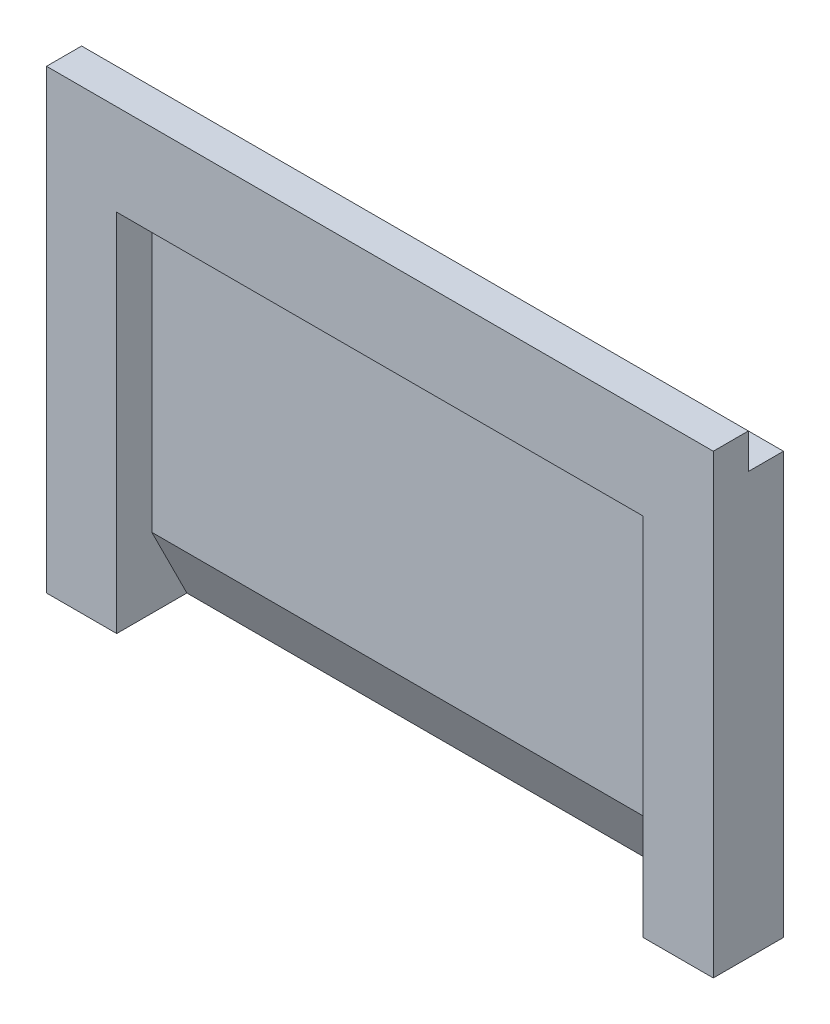
ISO-10303-21;
HEADER;
FILE_DESCRIPTION(('STEP AP214'),'2;1');
FILE_NAME('part.step','',(''),(''),'','','');
FILE_SCHEMA(('AUTOMOTIVE_DESIGN { 1 0 10303 214 1 1 1 1 }'));
ENDSEC;
DATA;
#1=APPLICATION_CONTEXT('core data for automotive mechanical design processes');
#2=APPLICATION_PROTOCOL_DEFINITION('international standard','automotive_design',2000,#1);
#3=PRODUCT_CONTEXT('',#1,'mechanical');
#4=PRODUCT('Part','Part','',(#3));
#5=PRODUCT_RELATED_PRODUCT_CATEGORY('part','',(#4));
#6=PRODUCT_DEFINITION_FORMATION('','',#4);
#7=PRODUCT_DEFINITION_CONTEXT('part definition',#1,'design');
#8=PRODUCT_DEFINITION('design','',#6,#7);
#9=PRODUCT_DEFINITION_SHAPE('','',#8);
#10=(LENGTH_UNIT() NAMED_UNIT(*) SI_UNIT(.MILLI.,.METRE.));
#11=(NAMED_UNIT(*) PLANE_ANGLE_UNIT() SI_UNIT($,.RADIAN.));
#12=(NAMED_UNIT(*) SI_UNIT($,.STERADIAN.) SOLID_ANGLE_UNIT());
#13=UNCERTAINTY_MEASURE_WITH_UNIT(LENGTH_MEASURE(1.E-05),#10,'distance_accuracy_value','');
#14=(GEOMETRIC_REPRESENTATION_CONTEXT(3) GLOBAL_UNCERTAINTY_ASSIGNED_CONTEXT((#13)) GLOBAL_UNIT_ASSIGNED_CONTEXT((#10,
#11,#12)) REPRESENTATION_CONTEXT('',''));
#15=CARTESIAN_POINT('',(0.,0.,0.));
#16=DIRECTION('',(0.,0.,1.));
#17=DIRECTION('',(1.,0.,0.));
#18=AXIS2_PLACEMENT_3D('',#15,#16,#17);
#19=CARTESIAN_POINT('',(0.,60.,10.));
#20=DIRECTION('',(0.,-1.,0.));
#21=DIRECTION('',(0.,0.,-1.));
#22=AXIS2_PLACEMENT_3D('',#19,#20,#21);
#23=PLANE('',#22);
#24=DIRECTION('',(-1.,0.,0.));
#25=VECTOR('',#24,1.);
#26=CARTESIAN_POINT('',(0.,60.,5.));
#27=LINE('',#26,#25);
#28=CARTESIAN_POINT('',(95.,60.,5.));
#29=VERTEX_POINT('',#28);
#30=CARTESIAN_POINT('',(0.,60.,5.));
#31=VERTEX_POINT('',#30);
#32=EDGE_CURVE('E50',#29,#31,#27,.T.);
#33=ORIENTED_EDGE('',*,*,#32,.F.);
#34=DIRECTION('',(0.,0.,-1.));
#35=VECTOR('',#34,1.);
#36=CARTESIAN_POINT('',(95.,60.,10.));
#37=LINE('',#36,#35);
#38=CARTESIAN_POINT('',(95.,60.,0.));
#39=VERTEX_POINT('',#38);
#40=EDGE_CURVE('E205',#29,#39,#37,.T.);
#41=ORIENTED_EDGE('',*,*,#40,.T.);
#42=DIRECTION('',(-1.,0.,0.));
#43=VECTOR('',#42,1.);
#44=CARTESIAN_POINT('',(0.,60.,0.));
#45=LINE('',#44,#43);
#46=CARTESIAN_POINT('',(0.,60.,0.));
#47=VERTEX_POINT('',#46);
#48=EDGE_CURVE('E129',#39,#47,#45,.T.);
#49=ORIENTED_EDGE('',*,*,#48,.T.);
#50=DIRECTION('',(0.,0.,-1.));
#51=VECTOR('',#50,1.);
#52=CARTESIAN_POINT('',(0.,60.,10.));
#53=LINE('',#52,#51);
#54=EDGE_CURVE('E193',#31,#47,#53,.T.);
#55=ORIENTED_EDGE('',*,*,#54,.F.);
#56=EDGE_LOOP('',(#33,#41,#49,#55));
#57=FACE_BOUND('',#56,.T.);
#58=ADVANCED_FACE('F35',(#57),#23,.F.);
#59=CARTESIAN_POINT('',(0.,0.,10.));
#60=DIRECTION('',(0.,1.,0.));
#61=DIRECTION('',(0.,0.,1.));
#62=AXIS2_PLACEMENT_3D('',#59,#60,#61);
#63=PLANE('',#62);
#64=DIRECTION('',(1.,0.,0.));
#65=VECTOR('',#64,1.);
#66=CARTESIAN_POINT('',(0.,0.,0.));
#67=LINE('',#66,#65);
#68=CARTESIAN_POINT('',(0.,0.,0.));
#69=VERTEX_POINT('',#68);
#70=CARTESIAN_POINT('',(10.,0.,0.));
#71=VERTEX_POINT('',#70);
#72=EDGE_CURVE('E196',#69,#71,#67,.T.);
#73=ORIENTED_EDGE('',*,*,#72,.T.);
#74=DIRECTION('',(0.,0.,-1.));
#75=VECTOR('',#74,1.);
#76=CARTESIAN_POINT('',(10.,0.,10.));
#77=LINE('',#76,#75);
#78=CARTESIAN_POINT('',(10.,0.,10.));
#79=VERTEX_POINT('',#78);
#80=EDGE_CURVE('E154',#79,#71,#77,.T.);
#81=ORIENTED_EDGE('',*,*,#80,.F.);
#82=DIRECTION('',(1.,0.,0.));
#83=VECTOR('',#82,1.);
#84=CARTESIAN_POINT('',(0.,0.,10.));
#85=LINE('',#84,#83);
#86=CARTESIAN_POINT('',(0.,0.,10.));
#87=VERTEX_POINT('',#86);
#88=EDGE_CURVE('E190',#87,#79,#85,.T.);
#89=ORIENTED_EDGE('',*,*,#88,.F.);
#90=DIRECTION('',(0.,0.,-1.));
#91=VECTOR('',#90,1.);
#92=CARTESIAN_POINT('',(0.,0.,10.));
#93=LINE('',#92,#91);
#94=EDGE_CURVE('E11',#87,#69,#93,.T.);
#95=ORIENTED_EDGE('',*,*,#94,.T.);
#96=EDGE_LOOP('',(#73,#81,#89,#95));
#97=FACE_BOUND('',#96,.T.);
#98=ADVANCED_FACE('F233',(#97),#63,.F.);
#99=CARTESIAN_POINT('',(0.,0.,10.));
#100=DIRECTION('',(0.,0.,-1.));
#101=DIRECTION('',(-1.,0.,0.));
#102=AXIS2_PLACEMENT_3D('',#99,#100,#101);
#103=PLANE('',#102);
#104=ORIENTED_EDGE('',*,*,#88,.T.);
#105=DIRECTION('',(0.,-1.,0.));
#106=VECTOR('',#105,1.);
#107=CARTESIAN_POINT('',(10.,50.,10.));
#108=LINE('',#107,#106);
#109=CARTESIAN_POINT('',(10.,52.,10.));
#110=VERTEX_POINT('',#109);
#111=EDGE_CURVE('E172',#110,#79,#108,.T.);
#112=ORIENTED_EDGE('',*,*,#111,.F.);
#113=DIRECTION('',(1.,0.,0.));
#114=VECTOR('',#113,1.);
#115=CARTESIAN_POINT('',(10.,52.,10.));
#116=LINE('',#115,#114);
#117=CARTESIAN_POINT('',(85.,52.,10.));
#118=VERTEX_POINT('',#117);
#119=EDGE_CURVE('E164',#110,#118,#116,.T.);
#120=ORIENTED_EDGE('',*,*,#119,.T.);
#121=DIRECTION('',(0.,1.,0.));
#122=VECTOR('',#121,1.);
#123=CARTESIAN_POINT('',(85.,10.,10.));
#124=LINE('',#123,#122);
#125=CARTESIAN_POINT('',(85.,0.,10.));
#126=VERTEX_POINT('',#125);
#127=EDGE_CURVE('E183',#126,#118,#124,.T.);
#128=ORIENTED_EDGE('',*,*,#127,.F.);
#129=CARTESIAN_POINT('',(95.,0.,10.));
#130=VERTEX_POINT('',#129);
#131=EDGE_CURVE('E128',#126,#130,#85,.T.);
#132=ORIENTED_EDGE('',*,*,#131,.T.);
#133=DIRECTION('',(0.,1.,0.));
#134=VECTOR('',#133,1.);
#135=CARTESIAN_POINT('',(95.,0.,10.));
#136=LINE('',#135,#134);
#137=CARTESIAN_POINT('',(95.,65.,10.));
#138=VERTEX_POINT('',#137);
#139=EDGE_CURVE('E135',#130,#138,#136,.T.);
#140=ORIENTED_EDGE('',*,*,#139,.T.);
#141=DIRECTION('',(1.,0.,0.));
#142=VECTOR('',#141,1.);
#143=CARTESIAN_POINT('',(0.,65.,10.));
#144=LINE('',#143,#142);
#145=CARTESIAN_POINT('',(0.,65.,10.));
#146=VERTEX_POINT('',#145);
#147=EDGE_CURVE('E132',#146,#138,#144,.T.);
#148=ORIENTED_EDGE('',*,*,#147,.F.);
#149=DIRECTION('',(0.,-1.,0.));
#150=VECTOR('',#149,1.);
#151=CARTESIAN_POINT('',(0.,0.,10.));
#152=LINE('',#151,#150);
#153=EDGE_CURVE('E120',#146,#87,#152,.T.);
#154=ORIENTED_EDGE('',*,*,#153,.T.);
#155=EDGE_LOOP('',(#104,#112,#120,#128,#132,#140,#148,#154));
#156=FACE_BOUND('',#155,.T.);
#157=ADVANCED_FACE('F133',(#156),#103,.F.);
#158=CARTESIAN_POINT('',(0.,0.,10.));
#159=DIRECTION('',(1.,0.,0.));
#160=DIRECTION('',(0.,0.,-1.));
#161=AXIS2_PLACEMENT_3D('',#158,#159,#160);
#162=PLANE('',#161);
#163=DIRECTION('',(0.,-1.,0.));
#164=VECTOR('',#163,1.);
#165=CARTESIAN_POINT('',(0.,0.,0.));
#166=LINE('',#165,#164);
#167=EDGE_CURVE('E188',#47,#69,#166,.T.);
#168=ORIENTED_EDGE('',*,*,#167,.T.);
#169=ORIENTED_EDGE('',*,*,#94,.F.);
#170=ORIENTED_EDGE('',*,*,#153,.F.);
#171=DIRECTION('',(0.,0.,1.));
#172=VECTOR('',#171,1.);
#173=CARTESIAN_POINT('',(0.,65.,10.));
#174=LINE('',#173,#172);
#175=CARTESIAN_POINT('',(0.,65.,5.));
#176=VERTEX_POINT('',#175);
#177=EDGE_CURVE('E125',#176,#146,#174,.T.);
#178=ORIENTED_EDGE('',*,*,#177,.F.);
#179=DIRECTION('',(0.,-1.,0.));
#180=VECTOR('',#179,1.);
#181=CARTESIAN_POINT('',(0.,65.,5.));
#182=LINE('',#181,#180);
#183=EDGE_CURVE('E148',#176,#31,#182,.T.);
#184=ORIENTED_EDGE('',*,*,#183,.T.);
#185=ORIENTED_EDGE('',*,*,#54,.T.);
#186=EDGE_LOOP('',(#168,#169,#170,#178,#184,#185));
#187=FACE_BOUND('',#186,.T.);
#188=ADVANCED_FACE('F37',(#187),#162,.F.);
#189=ORIENTED_EDGE('',*,*,#131,.F.);
#190=DIRECTION('',(0.,0.,-1.));
#191=VECTOR('',#190,1.);
#192=CARTESIAN_POINT('',(85.,0.,10.));
#193=LINE('',#192,#191);
#194=CARTESIAN_POINT('',(85.,0.,0.));
#195=VERTEX_POINT('',#194);
#196=EDGE_CURVE('E158',#126,#195,#193,.T.);
#197=ORIENTED_EDGE('',*,*,#196,.T.);
#198=CARTESIAN_POINT('',(95.,0.,0.));
#199=VERTEX_POINT('',#198);
#200=EDGE_CURVE('E195',#195,#199,#67,.T.);
#201=ORIENTED_EDGE('',*,*,#200,.T.);
#202=DIRECTION('',(0.,0.,-1.));
#203=VECTOR('',#202,1.);
#204=CARTESIAN_POINT('',(95.,0.,10.));
#205=LINE('',#204,#203);
#206=EDGE_CURVE('E43',#130,#199,#205,.T.);
#207=ORIENTED_EDGE('',*,*,#206,.F.);
#208=EDGE_LOOP('',(#189,#197,#201,#207));
#209=FACE_BOUND('',#208,.T.);
#210=ADVANCED_FACE('F239',(#209),#63,.F.);
#211=CARTESIAN_POINT('',(95.,0.,10.));
#212=DIRECTION('',(-1.,0.,0.));
#213=DIRECTION('',(0.,0.,1.));
#214=AXIS2_PLACEMENT_3D('',#211,#212,#213);
#215=PLANE('',#214);
#216=DIRECTION('',(0.,1.,0.));
#217=VECTOR('',#216,1.);
#218=CARTESIAN_POINT('',(95.,0.,0.));
#219=LINE('',#218,#217);
#220=EDGE_CURVE('E199',#199,#39,#219,.T.);
#221=ORIENTED_EDGE('',*,*,#220,.T.);
#222=ORIENTED_EDGE('',*,*,#40,.F.);
#223=DIRECTION('',(0.,-1.,0.));
#224=VECTOR('',#223,1.);
#225=CARTESIAN_POINT('',(95.,65.,5.));
#226=LINE('',#225,#224);
#227=CARTESIAN_POINT('',(95.,65.,5.));
#228=VERTEX_POINT('',#227);
#229=EDGE_CURVE('E151',#228,#29,#226,.T.);
#230=ORIENTED_EDGE('',*,*,#229,.F.);
#231=DIRECTION('',(0.,0.,-1.));
#232=VECTOR('',#231,1.);
#233=CARTESIAN_POINT('',(95.,65.,10.));
#234=LINE('',#233,#232);
#235=EDGE_CURVE('E138',#138,#228,#234,.T.);
#236=ORIENTED_EDGE('',*,*,#235,.F.);
#237=ORIENTED_EDGE('',*,*,#139,.F.);
#238=ORIENTED_EDGE('',*,*,#206,.T.);
#239=EDGE_LOOP('',(#221,#222,#230,#236,#237,#238));
#240=FACE_BOUND('',#239,.T.);
#241=ADVANCED_FACE('F210',(#240),#215,.F.);
#242=CARTESIAN_POINT('',(0.,0.,0.));
#243=DIRECTION('',(0.,0.,-1.));
#244=DIRECTION('',(-1.,0.,0.));
#245=AXIS2_PLACEMENT_3D('',#242,#243,#244);
#246=PLANE('',#245);
#247=ORIENTED_EDGE('',*,*,#167,.F.);
#248=ORIENTED_EDGE('',*,*,#48,.F.);
#249=ORIENTED_EDGE('',*,*,#220,.F.);
#250=ORIENTED_EDGE('',*,*,#200,.F.);
#251=DIRECTION('',(-1.,0.,0.));
#252=VECTOR('',#251,1.);
#253=CARTESIAN_POINT('',(99.142135623731,0.,0.));
#254=LINE('',#253,#252);
#255=EDGE_CURVE('E159',#195,#71,#254,.T.);
#256=ORIENTED_EDGE('',*,*,#255,.T.);
#257=ORIENTED_EDGE('',*,*,#72,.F.);
#258=EDGE_LOOP('',(#247,#248,#249,#250,#256,#257));
#259=FACE_BOUND('',#258,.T.);
#260=ADVANCED_FACE('F217',(#259),#246,.T.);
#261=CARTESIAN_POINT('',(10.,52.,5.));
#262=DIRECTION('',(0.,-1.,0.));
#263=DIRECTION('',(0.,0.,-1.));
#264=AXIS2_PLACEMENT_3D('',#261,#262,#263);
#265=PLANE('',#264);
#266=ORIENTED_EDGE('',*,*,#119,.F.);
#267=DIRECTION('',(0.,0.,1.));
#268=VECTOR('',#267,1.);
#269=CARTESIAN_POINT('',(10.,52.,5.));
#270=LINE('',#269,#268);
#271=CARTESIAN_POINT('',(10.,52.,5.));
#272=VERTEX_POINT('',#271);
#273=EDGE_CURVE('E58',#272,#110,#270,.T.);
#274=ORIENTED_EDGE('',*,*,#273,.F.);
#275=DIRECTION('',(1.,0.,0.));
#276=VECTOR('',#275,1.);
#277=CARTESIAN_POINT('',(10.,52.,5.));
#278=LINE('',#277,#276);
#279=CARTESIAN_POINT('',(85.,52.,5.));
#280=VERTEX_POINT('',#279);
#281=EDGE_CURVE('E171',#272,#280,#278,.T.);
#282=ORIENTED_EDGE('',*,*,#281,.T.);
#283=DIRECTION('',(0.,0.,1.));
#284=VECTOR('',#283,1.);
#285=CARTESIAN_POINT('',(85.,52.,5.));
#286=LINE('',#285,#284);
#287=EDGE_CURVE('E180',#280,#118,#286,.T.);
#288=ORIENTED_EDGE('',*,*,#287,.T.);
#289=EDGE_LOOP('',(#266,#274,#282,#288));
#290=FACE_BOUND('',#289,.T.);
#291=ADVANCED_FACE('F260',(#290),#265,.T.);
#292=CARTESIAN_POINT('',(85.,10.,5.));
#293=DIRECTION('',(1.,0.,0.));
#294=DIRECTION('',(0.,0.,-1.));
#295=AXIS2_PLACEMENT_3D('',#292,#293,#294);
#296=PLANE('',#295);
#297=ORIENTED_EDGE('',*,*,#127,.T.);
#298=ORIENTED_EDGE('',*,*,#287,.F.);
#299=DIRECTION('',(0.,-1.,0.));
#300=VECTOR('',#299,1.);
#301=CARTESIAN_POINT('',(85.,52.,5.));
#302=LINE('',#301,#300);
#303=CARTESIAN_POINT('',(85.,10.,5.));
#304=VERTEX_POINT('',#303);
#305=EDGE_CURVE('E174',#280,#304,#302,.T.);
#306=ORIENTED_EDGE('',*,*,#305,.T.);
#307=DIRECTION('',(0.,0.894427190999916,0.447213595499958));
#308=VECTOR('',#307,1.);
#309=CARTESIAN_POINT('',(85.,0.,0.));
#310=LINE('',#309,#308);
#311=EDGE_CURVE('E162',#195,#304,#310,.T.);
#312=ORIENTED_EDGE('',*,*,#311,.F.);
#313=ORIENTED_EDGE('',*,*,#196,.F.);
#314=EDGE_LOOP('',(#297,#298,#306,#312,#313));
#315=FACE_BOUND('',#314,.T.);
#316=ADVANCED_FACE('F252',(#315),#296,.F.);
#317=CARTESIAN_POINT('',(10.,50.,5.));
#318=DIRECTION('',(-1.,0.,0.));
#319=DIRECTION('',(0.,0.,1.));
#320=AXIS2_PLACEMENT_3D('',#317,#318,#319);
#321=PLANE('',#320);
#322=ORIENTED_EDGE('',*,*,#111,.T.);
#323=ORIENTED_EDGE('',*,*,#80,.T.);
#324=DIRECTION('',(0.,0.894427190999916,0.447213595499958));
#325=VECTOR('',#324,1.);
#326=CARTESIAN_POINT('',(10.,0.,0.));
#327=LINE('',#326,#325);
#328=CARTESIAN_POINT('',(10.,10.,5.));
#329=VERTEX_POINT('',#328);
#330=EDGE_CURVE('E155',#71,#329,#327,.T.);
#331=ORIENTED_EDGE('',*,*,#330,.T.);
#332=DIRECTION('',(0.,1.,0.));
#333=VECTOR('',#332,1.);
#334=CARTESIAN_POINT('',(10.,50.,5.));
#335=LINE('',#334,#333);
#336=EDGE_CURVE('E169',#329,#272,#335,.T.);
#337=ORIENTED_EDGE('',*,*,#336,.T.);
#338=ORIENTED_EDGE('',*,*,#273,.T.);
#339=EDGE_LOOP('',(#322,#323,#331,#337,#338));
#340=FACE_BOUND('',#339,.T.);
#341=ADVANCED_FACE('F256',(#340),#321,.F.);
#342=CARTESIAN_POINT('',(0.,0.,5.));
#343=DIRECTION('',(0.,0.,-1.));
#344=DIRECTION('',(-1.,0.,0.));
#345=AXIS2_PLACEMENT_3D('',#342,#343,#344);
#346=PLANE('',#345);
#347=ORIENTED_EDGE('',*,*,#336,.F.);
#348=DIRECTION('',(1.,0.,0.));
#349=VECTOR('',#348,1.);
#350=CARTESIAN_POINT('',(10.,10.,5.));
#351=LINE('',#350,#349);
#352=EDGE_CURVE('E177',#329,#304,#351,.T.);
#353=ORIENTED_EDGE('',*,*,#352,.T.);
#354=ORIENTED_EDGE('',*,*,#305,.F.);
#355=ORIENTED_EDGE('',*,*,#281,.F.);
#356=EDGE_LOOP('',(#347,#353,#354,#355));
#357=FACE_BOUND('',#356,.T.);
#358=ADVANCED_FACE('F229',(#357),#346,.F.);
#359=CARTESIAN_POINT('',(99.142135623731,0.,0.));
#360=DIRECTION('',(0.,-0.447213595499958,0.894427190999916));
#361=DIRECTION('',(0.,-0.894427190999916,-0.447213595499958));
#362=AXIS2_PLACEMENT_3D('',#359,#360,#361);
#363=PLANE('',#362);
#364=ORIENTED_EDGE('',*,*,#311,.T.);
#365=ORIENTED_EDGE('',*,*,#352,.F.);
#366=ORIENTED_EDGE('',*,*,#330,.F.);
#367=ORIENTED_EDGE('',*,*,#255,.F.);
#368=EDGE_LOOP('',(#364,#365,#366,#367));
#369=FACE_BOUND('',#368,.T.);
#370=ADVANCED_FACE('F222',(#369),#363,.T.);
#371=CARTESIAN_POINT('',(0.,65.,5.));
#372=DIRECTION('',(0.,0.,1.));
#373=DIRECTION('',(1.,0.,0.));
#374=AXIS2_PLACEMENT_3D('',#371,#372,#373);
#375=PLANE('',#374);
#376=ORIENTED_EDGE('',*,*,#32,.T.);
#377=ORIENTED_EDGE('',*,*,#183,.F.);
#378=DIRECTION('',(-1.,0.,0.));
#379=VECTOR('',#378,1.);
#380=CARTESIAN_POINT('',(0.,65.,5.));
#381=LINE('',#380,#379);
#382=EDGE_CURVE('E142',#228,#176,#381,.T.);
#383=ORIENTED_EDGE('',*,*,#382,.F.);
#384=ORIENTED_EDGE('',*,*,#229,.T.);
#385=EDGE_LOOP('',(#376,#377,#383,#384));
#386=FACE_BOUND('',#385,.T.);
#387=ADVANCED_FACE('F220',(#386),#375,.F.);
#388=CARTESIAN_POINT('',(0.,65.,0.));
#389=DIRECTION('',(0.,-1.,0.));
#390=DIRECTION('',(0.,0.,-1.));
#391=AXIS2_PLACEMENT_3D('',#388,#389,#390);
#392=PLANE('',#391);
#393=ORIENTED_EDGE('',*,*,#177,.T.);
#394=ORIENTED_EDGE('',*,*,#147,.T.);
#395=ORIENTED_EDGE('',*,*,#235,.T.);
#396=ORIENTED_EDGE('',*,*,#382,.T.);
#397=EDGE_LOOP('',(#393,#394,#395,#396));
#398=FACE_BOUND('',#397,.T.);
#399=ADVANCED_FACE('F140',(#398),#392,.F.);
#400=CLOSED_SHELL('',(#58,#98,#157,#188,#210,#241,#260,#291,#316,#341,#358,#370,#387,#399));
#401=MANIFOLD_SOLID_BREP('B2',#400);
#402=ADVANCED_BREP_SHAPE_REPRESENTATION('',(#18,#401),#14);
#403=SHAPE_DEFINITION_REPRESENTATION(#9,#402);
ENDSEC;
END-ISO-10303-21;
